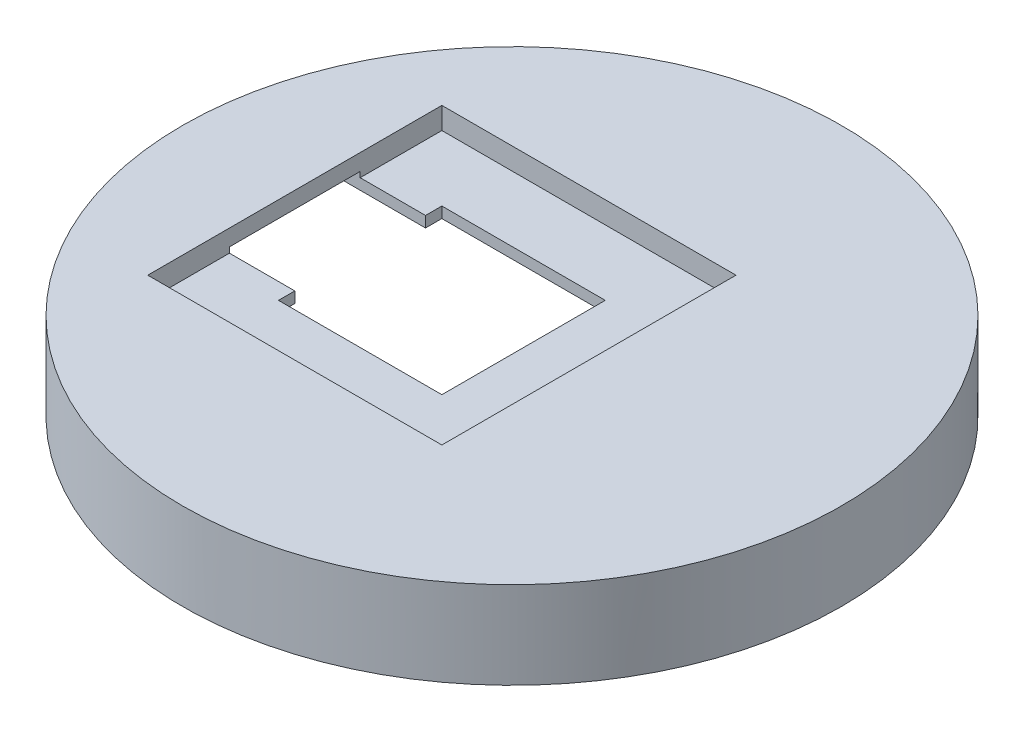
ISO-10303-21;
HEADER;
FILE_DESCRIPTION(('STEP AP214'),'2;1');
FILE_NAME('part.step','',(''),(''),'','','');
FILE_SCHEMA(('AUTOMOTIVE_DESIGN { 1 0 10303 214 1 1 1 1 }'));
ENDSEC;
DATA;
#1=APPLICATION_CONTEXT('core data for automotive mechanical design processes');
#2=APPLICATION_PROTOCOL_DEFINITION('international standard','automotive_design',2000,#1);
#3=PRODUCT_CONTEXT('',#1,'mechanical');
#4=PRODUCT('Part','Part','',(#3));
#5=PRODUCT_RELATED_PRODUCT_CATEGORY('part','',(#4));
#6=PRODUCT_DEFINITION_FORMATION('','',#4);
#7=PRODUCT_DEFINITION_CONTEXT('part definition',#1,'design');
#8=PRODUCT_DEFINITION('design','',#6,#7);
#9=PRODUCT_DEFINITION_SHAPE('','',#8);
#10=(LENGTH_UNIT() NAMED_UNIT(*) SI_UNIT(.MILLI.,.METRE.));
#11=(NAMED_UNIT(*) PLANE_ANGLE_UNIT() SI_UNIT($,.RADIAN.));
#12=(NAMED_UNIT(*) SI_UNIT($,.STERADIAN.) SOLID_ANGLE_UNIT());
#13=UNCERTAINTY_MEASURE_WITH_UNIT(LENGTH_MEASURE(1.E-05),#10,'distance_accuracy_value','');
#14=(GEOMETRIC_REPRESENTATION_CONTEXT(3) GLOBAL_UNCERTAINTY_ASSIGNED_CONTEXT((#13)) GLOBAL_UNIT_ASSIGNED_CONTEXT((#10,
#11,#12)) REPRESENTATION_CONTEXT('',''));
#15=CARTESIAN_POINT('',(0.,0.,0.));
#16=DIRECTION('',(0.,0.,1.));
#17=DIRECTION('',(1.,0.,0.));
#18=AXIS2_PLACEMENT_3D('',#15,#16,#17);
#19=CARTESIAN_POINT('',(1.06149692592431,8.000012,-7.49999999999999));
#20=DIRECTION('',(-1.,0.,0.));
#21=DIRECTION('',(0.,0.,1.));
#22=AXIS2_PLACEMENT_3D('',#19,#20,#21);
#23=PLANE('',#22);
#24=DIRECTION('',(0.,-1.,0.));
#25=VECTOR('',#24,1.);
#26=CARTESIAN_POINT('',(1.06149692592431,8.000012,7.5));
#27=LINE('',#26,#25);
#28=CARTESIAN_POINT('',(1.06149692592431,6.,7.5));
#29=VERTEX_POINT('',#28);
#30=CARTESIAN_POINT('',(1.06149692592431,5.,7.5));
#31=VERTEX_POINT('',#30);
#32=EDGE_CURVE('E231',#29,#31,#27,.T.);
#33=ORIENTED_EDGE('',*,*,#32,.F.);
#34=DIRECTION('',(0.,0.,-1.));
#35=VECTOR('',#34,1.);
#36=CARTESIAN_POINT('',(1.06149692592431,6.,-7.49999999999999));
#37=LINE('',#36,#35);
#38=CARTESIAN_POINT('',(1.06149692592431,6.,-7.49999999999999));
#39=VERTEX_POINT('',#38);
#40=EDGE_CURVE('E208',#29,#39,#37,.T.);
#41=ORIENTED_EDGE('',*,*,#40,.T.);
#42=DIRECTION('',(0.,-1.,0.));
#43=VECTOR('',#42,1.);
#44=CARTESIAN_POINT('',(1.06149692592431,8.000012,-7.49999999999999));
#45=LINE('',#44,#43);
#46=CARTESIAN_POINT('',(1.06149692592431,5.,-7.49999999999999));
#47=VERTEX_POINT('',#46);
#48=EDGE_CURVE('E240',#39,#47,#45,.T.);
#49=ORIENTED_EDGE('',*,*,#48,.T.);
#50=DIRECTION('',(0.,0.,1.));
#51=VECTOR('',#50,1.);
#52=CARTESIAN_POINT('',(1.06149692592431,5.,0.));
#53=LINE('',#52,#51);
#54=EDGE_CURVE('E260',#47,#31,#53,.T.);
#55=ORIENTED_EDGE('',*,*,#54,.T.);
#56=EDGE_LOOP('',(#33,#41,#49,#55));
#57=FACE_BOUND('',#56,.T.);
#58=ADVANCED_FACE('F43',(#57),#23,.T.);
#59=CARTESIAN_POINT('',(-13.9385030740757,8.000012,-7.49999999999999));
#60=DIRECTION('',(0.,0.,1.));
#61=DIRECTION('',(1.,0.,0.));
#62=AXIS2_PLACEMENT_3D('',#59,#60,#61);
#63=PLANE('',#62);
#64=ORIENTED_EDGE('',*,*,#48,.F.);
#65=DIRECTION('',(-1.,0.,0.));
#66=VECTOR('',#65,1.);
#67=CARTESIAN_POINT('',(-13.9385030740757,6.,-7.49999999999999));
#68=LINE('',#67,#66);
#69=CARTESIAN_POINT('',(-13.9385030740757,6.,-7.49999999999999));
#70=VERTEX_POINT('',#69);
#71=EDGE_CURVE('E216',#39,#70,#68,.T.);
#72=ORIENTED_EDGE('',*,*,#71,.T.);
#73=DIRECTION('',(0.,-1.,0.));
#74=VECTOR('',#73,1.);
#75=CARTESIAN_POINT('',(-13.9385030740757,8.000012,-7.49999999999999));
#76=LINE('',#75,#74);
#77=CARTESIAN_POINT('',(-13.9385030740757,5.,-7.49999999999999));
#78=VERTEX_POINT('',#77);
#79=EDGE_CURVE('E237',#70,#78,#76,.T.);
#80=ORIENTED_EDGE('',*,*,#79,.T.);
#81=DIRECTION('',(1.,0.,0.));
#82=VECTOR('',#81,1.);
#83=CARTESIAN_POINT('',(0.,5.,-7.49999999999999));
#84=LINE('',#83,#82);
#85=EDGE_CURVE('E256',#78,#47,#84,.T.);
#86=ORIENTED_EDGE('',*,*,#85,.T.);
#87=EDGE_LOOP('',(#64,#72,#80,#86));
#88=FACE_BOUND('',#87,.T.);
#89=ADVANCED_FACE('F374',(#88),#63,.T.);
#90=CARTESIAN_POINT('',(-13.9385030740757,8.000012,7.5));
#91=DIRECTION('',(0.,0.,-1.));
#92=DIRECTION('',(-1.,0.,0.));
#93=AXIS2_PLACEMENT_3D('',#90,#91,#92);
#94=PLANE('',#93);
#95=DIRECTION('',(0.,-1.,0.));
#96=VECTOR('',#95,1.);
#97=CARTESIAN_POINT('',(-13.9385030740757,8.000012,7.5));
#98=LINE('',#97,#96);
#99=CARTESIAN_POINT('',(-13.9385030740757,6.,7.5));
#100=VERTEX_POINT('',#99);
#101=CARTESIAN_POINT('',(-13.9385030740757,5.,7.5));
#102=VERTEX_POINT('',#101);
#103=EDGE_CURVE('E234',#100,#102,#98,.T.);
#104=ORIENTED_EDGE('',*,*,#103,.F.);
#105=DIRECTION('',(1.,0.,0.));
#106=VECTOR('',#105,1.);
#107=CARTESIAN_POINT('',(-13.9385030740757,6.,7.5));
#108=LINE('',#107,#106);
#109=EDGE_CURVE('E67',#100,#29,#108,.T.);
#110=ORIENTED_EDGE('',*,*,#109,.T.);
#111=ORIENTED_EDGE('',*,*,#32,.T.);
#112=DIRECTION('',(-1.,0.,0.));
#113=VECTOR('',#112,1.);
#114=CARTESIAN_POINT('',(0.,5.,7.5));
#115=LINE('',#114,#113);
#116=EDGE_CURVE('E252',#31,#102,#115,.T.);
#117=ORIENTED_EDGE('',*,*,#116,.T.);
#118=EDGE_LOOP('',(#104,#110,#111,#117));
#119=FACE_BOUND('',#118,.T.);
#120=ADVANCED_FACE('F369',(#119),#94,.T.);
#121=CARTESIAN_POINT('',(-13.9385030740757,8.000012,-7.49999999999999));
#122=DIRECTION('',(1.,0.,0.));
#123=DIRECTION('',(0.,0.,-1.));
#124=AXIS2_PLACEMENT_3D('',#121,#122,#123);
#125=PLANE('',#124);
#126=ORIENTED_EDGE('',*,*,#79,.F.);
#127=DIRECTION('',(0.,0.,1.));
#128=VECTOR('',#127,1.);
#129=CARTESIAN_POINT('',(-13.9385030740757,6.,-7.49999999999999));
#130=LINE('',#129,#128);
#131=CARTESIAN_POINT('',(-13.9385030740757,6.,-6.));
#132=VERTEX_POINT('',#131);
#133=EDGE_CURVE('E52',#70,#132,#130,.T.);
#134=ORIENTED_EDGE('',*,*,#133,.T.);
#135=DIRECTION('',(0.,1.,0.));
#136=VECTOR('',#135,1.);
#137=CARTESIAN_POINT('',(-13.9385030740757,6.5,-6.));
#138=LINE('',#137,#136);
#139=CARTESIAN_POINT('',(-13.9385030740757,5.,-6.));
#140=VERTEX_POINT('',#139);
#141=EDGE_CURVE('E247',#140,#132,#138,.T.);
#142=ORIENTED_EDGE('',*,*,#141,.F.);
#143=DIRECTION('',(0.,0.,-1.));
#144=VECTOR('',#143,1.);
#145=CARTESIAN_POINT('',(-13.9385030740757,5.,0.));
#146=LINE('',#145,#144);
#147=EDGE_CURVE('E248',#140,#78,#146,.T.);
#148=ORIENTED_EDGE('',*,*,#147,.T.);
#149=EDGE_LOOP('',(#126,#134,#142,#148));
#150=FACE_BOUND('',#149,.T.);
#151=ADVANCED_FACE('F331',(#150),#125,.T.);
#152=DIRECTION('',(0.,-1.,0.));
#153=VECTOR('',#152,1.);
#154=CARTESIAN_POINT('',(-13.9385030740757,6.5,6.));
#155=LINE('',#154,#153);
#156=CARTESIAN_POINT('',(-13.9385030740757,6.,6.));
#157=VERTEX_POINT('',#156);
#158=CARTESIAN_POINT('',(-13.9385030740757,5.,6.));
#159=VERTEX_POINT('',#158);
#160=EDGE_CURVE('E320',#157,#159,#155,.T.);
#161=ORIENTED_EDGE('',*,*,#160,.F.);
#162=EDGE_CURVE('E322',#157,#100,#130,.T.);
#163=ORIENTED_EDGE('',*,*,#162,.T.);
#164=ORIENTED_EDGE('',*,*,#103,.T.);
#165=EDGE_CURVE('E243',#102,#159,#146,.T.);
#166=ORIENTED_EDGE('',*,*,#165,.T.);
#167=EDGE_LOOP('',(#161,#163,#164,#166));
#168=FACE_BOUND('',#167,.T.);
#169=ADVANCED_FACE('F364',(#168),#125,.T.);
#170=CARTESIAN_POINT('',(0.,5.,0.));
#171=DIRECTION('',(0.,1.,0.));
#172=DIRECTION('',(0.,0.,1.));
#173=AXIS2_PLACEMENT_3D('',#170,#171,#172);
#174=PLANE('',#173);
#175=ORIENTED_EDGE('',*,*,#147,.F.);
#176=DIRECTION('',(1.,0.,0.));
#177=VECTOR('',#176,1.);
#178=CARTESIAN_POINT('',(0.,5.,-6.));
#179=LINE('',#178,#177);
#180=CARTESIAN_POINT('',(-28.1169432904788,5.,-6.));
#181=VERTEX_POINT('',#180);
#182=EDGE_CURVE('E312',#181,#140,#179,.T.);
#183=ORIENTED_EDGE('',*,*,#182,.F.);
#184=CARTESIAN_POINT('',(0.,5.,0.));
#185=DIRECTION('',(0.,1.,0.));
#186=DIRECTION('',(0.,0.,1.));
#187=AXIS2_PLACEMENT_3D('',#184,#185,#186);
#188=CIRCLE('',#187,28.75);
#189=CARTESIAN_POINT('',(-28.1169432904788,5.,6.));
#190=VERTEX_POINT('',#189);
#191=EDGE_CURVE('E294',#190,#181,#188,.T.);
#192=ORIENTED_EDGE('',*,*,#191,.F.);
#193=DIRECTION('',(-1.,0.,0.));
#194=VECTOR('',#193,1.);
#195=CARTESIAN_POINT('',(0.,5.,6.));
#196=LINE('',#195,#194);
#197=EDGE_CURVE('E306',#159,#190,#196,.T.);
#198=ORIENTED_EDGE('',*,*,#197,.F.);
#199=ORIENTED_EDGE('',*,*,#165,.F.);
#200=ORIENTED_EDGE('',*,*,#116,.F.);
#201=ORIENTED_EDGE('',*,*,#54,.F.);
#202=ORIENTED_EDGE('',*,*,#85,.F.);
#203=EDGE_LOOP('',(#175,#183,#192,#198,#199,#200,#201,#202));
#204=FACE_BOUND('',#203,.T.);
#205=ADVANCED_FACE('F340',(#204),#174,.F.);
#206=CARTESIAN_POINT('',(0.,8.,0.));
#207=DIRECTION('',(0.,1.,0.));
#208=DIRECTION('',(0.,0.,1.));
#209=AXIS2_PLACEMENT_3D('',#206,#207,#208);
#210=PLANE('',#209);
#211=DIRECTION('',(0.,0.,-1.));
#212=VECTOR('',#211,1.);
#213=CARTESIAN_POINT('',(7.06149692592431,8.,-13.5));
#214=LINE('',#213,#212);
#215=CARTESIAN_POINT('',(7.06149692592431,8.,13.5));
#216=VERTEX_POINT('',#215);
#217=CARTESIAN_POINT('',(7.06149692592431,8.,-13.5));
#218=VERTEX_POINT('',#217);
#219=EDGE_CURVE('E59',#216,#218,#214,.T.);
#220=ORIENTED_EDGE('',*,*,#219,.F.);
#221=DIRECTION('',(1.,0.,0.));
#222=VECTOR('',#221,1.);
#223=CARTESIAN_POINT('',(-19.9385030740757,8.,13.5));
#224=LINE('',#223,#222);
#225=CARTESIAN_POINT('',(-19.9385030740757,8.,13.5));
#226=VERTEX_POINT('',#225);
#227=EDGE_CURVE('E178',#226,#216,#224,.T.);
#228=ORIENTED_EDGE('',*,*,#227,.F.);
#229=DIRECTION('',(0.,0.,1.));
#230=VECTOR('',#229,1.);
#231=CARTESIAN_POINT('',(-19.9385030740757,8.,-13.5));
#232=LINE('',#231,#230);
#233=CARTESIAN_POINT('',(-19.9385030740757,8.,-13.5));
#234=VERTEX_POINT('',#233);
#235=EDGE_CURVE('E182',#234,#226,#232,.T.);
#236=ORIENTED_EDGE('',*,*,#235,.F.);
#237=DIRECTION('',(-1.,0.,0.));
#238=VECTOR('',#237,1.);
#239=CARTESIAN_POINT('',(-19.9385030740757,8.,-13.5));
#240=LINE('',#239,#238);
#241=EDGE_CURVE('E192',#218,#234,#240,.T.);
#242=ORIENTED_EDGE('',*,*,#241,.F.);
#243=EDGE_LOOP('',(#220,#228,#236,#242));
#244=FACE_BOUND('',#243,.T.);
#245=CARTESIAN_POINT('',(0.,8.,0.));
#246=DIRECTION('',(0.,1.,0.));
#247=DIRECTION('',(0.,0.,1.));
#248=AXIS2_PLACEMENT_3D('',#245,#246,#247);
#249=CIRCLE('',#248,30.25);
#250=CARTESIAN_POINT('',(0.,8.,30.25));
#251=VERTEX_POINT('',#250);
#252=EDGE_CURVE('E302',#251,#251,#249,.T.);
#253=ORIENTED_EDGE('',*,*,#252,.T.);
#254=EDGE_LOOP('',(#253));
#255=FACE_BOUND('',#254,.T.);
#256=ADVANCED_FACE('F382',(#244,#255),#210,.T.);
#257=CARTESIAN_POINT('',(0.,6.5,0.));
#258=DIRECTION('',(0.,1.,0.));
#259=DIRECTION('',(0.,0.,1.));
#260=AXIS2_PLACEMENT_3D('',#257,#258,#259);
#261=PLANE('',#260);
#262=DIRECTION('',(-1.,0.,0.));
#263=VECTOR('',#262,1.);
#264=CARTESIAN_POINT('',(-142.526664036245,6.5,-6.));
#265=LINE('',#264,#263);
#266=CARTESIAN_POINT('',(-19.9385030740757,6.5,-6.));
#267=VERTEX_POINT('',#266);
#268=CARTESIAN_POINT('',(-29.648988178351,6.5,-6.));
#269=VERTEX_POINT('',#268);
#270=EDGE_CURVE('E265',#267,#269,#265,.T.);
#271=ORIENTED_EDGE('',*,*,#270,.F.);
#272=DIRECTION('',(0.,0.,1.));
#273=VECTOR('',#272,1.);
#274=CARTESIAN_POINT('',(-19.9385030740757,6.5,0.));
#275=LINE('',#274,#273);
#276=CARTESIAN_POINT('',(-19.9385030740757,6.5,6.));
#277=VERTEX_POINT('',#276);
#278=EDGE_CURVE('E224',#267,#277,#275,.T.);
#279=ORIENTED_EDGE('',*,*,#278,.T.);
#280=DIRECTION('',(1.,0.,0.));
#281=VECTOR('',#280,1.);
#282=CARTESIAN_POINT('',(-142.526664036245,6.5,6.));
#283=LINE('',#282,#281);
#284=CARTESIAN_POINT('',(-29.648988178351,6.5,6.));
#285=VERTEX_POINT('',#284);
#286=EDGE_CURVE('E268',#285,#277,#283,.T.);
#287=ORIENTED_EDGE('',*,*,#286,.F.);
#288=CARTESIAN_POINT('',(0.,6.5,0.));
#289=DIRECTION('',(0.,1.,0.));
#290=DIRECTION('',(0.,0.,1.));
#291=AXIS2_PLACEMENT_3D('',#288,#289,#290);
#292=CIRCLE('',#291,30.25);
#293=EDGE_CURVE('E316',#269,#285,#292,.T.);
#294=ORIENTED_EDGE('',*,*,#293,.F.);
#295=EDGE_LOOP('',(#271,#279,#287,#294));
#296=FACE_BOUND('',#295,.T.);
#297=ADVANCED_FACE('F359',(#296),#261,.F.);
#298=CARTESIAN_POINT('',(-142.526664036245,6.5,-6.));
#299=DIRECTION('',(0.,0.,1.));
#300=DIRECTION('',(1.,0.,0.));
#301=AXIS2_PLACEMENT_3D('',#298,#299,#300);
#302=PLANE('',#301);
#303=DIRECTION('',(0.,-1.,0.));
#304=VECTOR('',#303,1.);
#305=CARTESIAN_POINT('',(-19.9385030740757,6.5,-6.));
#306=LINE('',#305,#304);
#307=CARTESIAN_POINT('',(-19.9385030740757,6.,-6.));
#308=VERTEX_POINT('',#307);
#309=EDGE_CURVE('E228',#267,#308,#306,.T.);
#310=ORIENTED_EDGE('',*,*,#309,.F.);
#311=ORIENTED_EDGE('',*,*,#270,.T.);
#312=DIRECTION('',(0.,-1.,0.));
#313=VECTOR('',#312,1.);
#314=CARTESIAN_POINT('',(-29.648988178351,8.,-6.));
#315=LINE('',#314,#313);
#316=CARTESIAN_POINT('',(-29.648988178351,0.,-6.));
#317=VERTEX_POINT('',#316);
#318=EDGE_CURVE('E290',#269,#317,#315,.T.);
#319=ORIENTED_EDGE('',*,*,#318,.T.);
#320=DIRECTION('',(-1.,0.,0.));
#321=VECTOR('',#320,1.);
#322=CARTESIAN_POINT('',(-142.526664036245,0.,-6.));
#323=LINE('',#322,#321);
#324=CARTESIAN_POINT('',(-28.1169432904788,0.,-6.));
#325=VERTEX_POINT('',#324);
#326=EDGE_CURVE('E264',#325,#317,#323,.T.);
#327=ORIENTED_EDGE('',*,*,#326,.F.);
#328=DIRECTION('',(0.,-1.,0.));
#329=VECTOR('',#328,1.);
#330=CARTESIAN_POINT('',(-28.1169432904788,5.,-6.));
#331=LINE('',#330,#329);
#332=EDGE_CURVE('E286',#181,#325,#331,.T.);
#333=ORIENTED_EDGE('',*,*,#332,.F.);
#334=ORIENTED_EDGE('',*,*,#182,.T.);
#335=ORIENTED_EDGE('',*,*,#141,.T.);
#336=DIRECTION('',(-1.,0.,0.));
#337=VECTOR('',#336,1.);
#338=CARTESIAN_POINT('',(-142.526664036245,6.,-6.));
#339=LINE('',#338,#337);
#340=EDGE_CURVE('E220',#132,#308,#339,.T.);
#341=ORIENTED_EDGE('',*,*,#340,.T.);
#342=EDGE_LOOP('',(#310,#311,#319,#327,#333,#334,#335,#341));
#343=FACE_BOUND('',#342,.T.);
#344=ADVANCED_FACE('F336',(#343),#302,.T.);
#345=CARTESIAN_POINT('',(-142.526664036245,6.5,6.));
#346=DIRECTION('',(0.,0.,-1.));
#347=DIRECTION('',(-1.,0.,0.));
#348=AXIS2_PLACEMENT_3D('',#345,#346,#347);
#349=PLANE('',#348);
#350=DIRECTION('',(0.,1.,0.));
#351=VECTOR('',#350,1.);
#352=CARTESIAN_POINT('',(-19.9385030740757,6.5,6.));
#353=LINE('',#352,#351);
#354=CARTESIAN_POINT('',(-19.9385030740757,6.,6.));
#355=VERTEX_POINT('',#354);
#356=EDGE_CURVE('E11',#355,#277,#353,.T.);
#357=ORIENTED_EDGE('',*,*,#356,.F.);
#358=DIRECTION('',(1.,0.,0.));
#359=VECTOR('',#358,1.);
#360=CARTESIAN_POINT('',(-142.526664036245,6.,6.));
#361=LINE('',#360,#359);
#362=EDGE_CURVE('E212',#355,#157,#361,.T.);
#363=ORIENTED_EDGE('',*,*,#362,.T.);
#364=ORIENTED_EDGE('',*,*,#160,.T.);
#365=ORIENTED_EDGE('',*,*,#197,.T.);
#366=DIRECTION('',(0.,-1.,0.));
#367=VECTOR('',#366,1.);
#368=CARTESIAN_POINT('',(-28.1169432904788,5.,6.));
#369=LINE('',#368,#367);
#370=CARTESIAN_POINT('',(-28.1169432904788,0.,6.));
#371=VERTEX_POINT('',#370);
#372=EDGE_CURVE('E273',#371,#190,#369,.F.);
#373=ORIENTED_EDGE('',*,*,#372,.F.);
#374=DIRECTION('',(1.,0.,0.));
#375=VECTOR('',#374,1.);
#376=CARTESIAN_POINT('',(-142.526664036245,0.,6.));
#377=LINE('',#376,#375);
#378=CARTESIAN_POINT('',(-29.648988178351,0.,6.));
#379=VERTEX_POINT('',#378);
#380=EDGE_CURVE('E269',#379,#371,#377,.T.);
#381=ORIENTED_EDGE('',*,*,#380,.F.);
#382=DIRECTION('',(0.,-1.,0.));
#383=VECTOR('',#382,1.);
#384=CARTESIAN_POINT('',(-29.648988178351,8.,6.));
#385=LINE('',#384,#383);
#386=EDGE_CURVE('E283',#379,#285,#385,.F.);
#387=ORIENTED_EDGE('',*,*,#386,.T.);
#388=ORIENTED_EDGE('',*,*,#286,.T.);
#389=EDGE_LOOP('',(#357,#363,#364,#365,#373,#381,#387,#388));
#390=FACE_BOUND('',#389,.T.);
#391=ADVANCED_FACE('F348',(#390),#349,.T.);
#392=CARTESIAN_POINT('',(0.,8.,0.));
#393=DIRECTION('',(0.,-1.,0.));
#394=DIRECTION('',(0.,0.,-1.));
#395=AXIS2_PLACEMENT_3D('',#392,#393,#394);
#396=CYLINDRICAL_SURFACE('',#395,30.25);
#397=ORIENTED_EDGE('',*,*,#252,.F.);
#398=EDGE_LOOP('',(#397));
#399=FACE_BOUND('',#398,.T.);
#400=ORIENTED_EDGE('',*,*,#318,.F.);
#401=ORIENTED_EDGE('',*,*,#293,.T.);
#402=ORIENTED_EDGE('',*,*,#386,.F.);
#403=CARTESIAN_POINT('',(0.,0.,0.));
#404=DIRECTION('',(0.,1.,0.));
#405=DIRECTION('',(0.,0.,1.));
#406=AXIS2_PLACEMENT_3D('',#403,#404,#405);
#407=CIRCLE('',#406,30.25);
#408=EDGE_CURVE('E298',#379,#317,#407,.T.);
#409=ORIENTED_EDGE('',*,*,#408,.T.);
#410=EDGE_LOOP('',(#400,#401,#402,#409));
#411=FACE_BOUND('',#410,.T.);
#412=ADVANCED_FACE('F45',(#399,#411),#396,.T.);
#413=CARTESIAN_POINT('',(0.,0.,0.));
#414=DIRECTION('',(0.,1.,0.));
#415=DIRECTION('',(0.,0.,1.));
#416=AXIS2_PLACEMENT_3D('',#413,#414,#415);
#417=PLANE('',#416);
#418=ORIENTED_EDGE('',*,*,#326,.T.);
#419=ORIENTED_EDGE('',*,*,#408,.F.);
#420=ORIENTED_EDGE('',*,*,#380,.T.);
#421=CARTESIAN_POINT('',(0.,0.,0.));
#422=DIRECTION('',(0.,1.,0.));
#423=DIRECTION('',(0.,0.,1.));
#424=AXIS2_PLACEMENT_3D('',#421,#422,#423);
#425=CIRCLE('',#424,28.75);
#426=EDGE_CURVE('E293',#371,#325,#425,.T.);
#427=ORIENTED_EDGE('',*,*,#426,.T.);
#428=EDGE_LOOP('',(#418,#419,#420,#427));
#429=FACE_BOUND('',#428,.T.);
#430=ADVANCED_FACE('F352',(#429),#417,.F.);
#431=CARTESIAN_POINT('',(0.,5.,0.));
#432=DIRECTION('',(0.,-1.,0.));
#433=DIRECTION('',(0.,0.,-1.));
#434=AXIS2_PLACEMENT_3D('',#431,#432,#433);
#435=CYLINDRICAL_SURFACE('',#434,28.75);
#436=ORIENTED_EDGE('',*,*,#191,.T.);
#437=ORIENTED_EDGE('',*,*,#332,.T.);
#438=ORIENTED_EDGE('',*,*,#426,.F.);
#439=ORIENTED_EDGE('',*,*,#372,.T.);
#440=EDGE_LOOP('',(#436,#437,#438,#439));
#441=FACE_BOUND('',#440,.T.);
#442=ADVANCED_FACE('F344',(#441),#435,.F.);
#443=CARTESIAN_POINT('',(7.06149692592431,6.,-13.5));
#444=DIRECTION('',(1.,0.,0.));
#445=DIRECTION('',(0.,0.,-1.));
#446=AXIS2_PLACEMENT_3D('',#443,#444,#445);
#447=PLANE('',#446);
#448=ORIENTED_EDGE('',*,*,#219,.T.);
#449=DIRECTION('',(0.,1.,0.));
#450=VECTOR('',#449,1.);
#451=CARTESIAN_POINT('',(7.06149692592431,6.,-13.5));
#452=LINE('',#451,#450);
#453=CARTESIAN_POINT('',(7.06149692592431,6.,-13.5));
#454=VERTEX_POINT('',#453);
#455=EDGE_CURVE('E154',#454,#218,#452,.T.);
#456=ORIENTED_EDGE('',*,*,#455,.F.);
#457=DIRECTION('',(0.,0.,-1.));
#458=VECTOR('',#457,1.);
#459=CARTESIAN_POINT('',(7.06149692592431,6.,-13.5));
#460=LINE('',#459,#458);
#461=CARTESIAN_POINT('',(7.06149692592431,6.,13.5));
#462=VERTEX_POINT('',#461);
#463=EDGE_CURVE('E158',#462,#454,#460,.T.);
#464=ORIENTED_EDGE('',*,*,#463,.F.);
#465=DIRECTION('',(0.,1.,0.));
#466=VECTOR('',#465,1.);
#467=CARTESIAN_POINT('',(7.06149692592431,6.,13.5));
#468=LINE('',#467,#466);
#469=EDGE_CURVE('E198',#462,#216,#468,.T.);
#470=ORIENTED_EDGE('',*,*,#469,.T.);
#471=EDGE_LOOP('',(#448,#456,#464,#470));
#472=FACE_BOUND('',#471,.T.);
#473=ADVANCED_FACE('F156',(#472),#447,.F.);
#474=CARTESIAN_POINT('',(-19.9385030740757,6.,13.5));
#475=DIRECTION('',(0.,0.,1.));
#476=DIRECTION('',(1.,0.,0.));
#477=AXIS2_PLACEMENT_3D('',#474,#475,#476);
#478=PLANE('',#477);
#479=ORIENTED_EDGE('',*,*,#227,.T.);
#480=ORIENTED_EDGE('',*,*,#469,.F.);
#481=DIRECTION('',(1.,0.,0.));
#482=VECTOR('',#481,1.);
#483=CARTESIAN_POINT('',(-19.9385030740757,6.,13.5));
#484=LINE('',#483,#482);
#485=CARTESIAN_POINT('',(-19.9385030740757,6.,13.5));
#486=VERTEX_POINT('',#485);
#487=EDGE_CURVE('E165',#486,#462,#484,.T.);
#488=ORIENTED_EDGE('',*,*,#487,.F.);
#489=DIRECTION('',(0.,1.,0.));
#490=VECTOR('',#489,1.);
#491=CARTESIAN_POINT('',(-19.9385030740757,6.,13.5));
#492=LINE('',#491,#490);
#493=EDGE_CURVE('E201',#486,#226,#492,.T.);
#494=ORIENTED_EDGE('',*,*,#493,.T.);
#495=EDGE_LOOP('',(#479,#480,#488,#494));
#496=FACE_BOUND('',#495,.T.);
#497=ADVANCED_FACE('F380',(#496),#478,.F.);
#498=CARTESIAN_POINT('',(-19.9385030740757,6.,-13.5));
#499=DIRECTION('',(-1.,0.,0.));
#500=DIRECTION('',(0.,0.,1.));
#501=AXIS2_PLACEMENT_3D('',#498,#499,#500);
#502=PLANE('',#501);
#503=ORIENTED_EDGE('',*,*,#309,.T.);
#504=DIRECTION('',(0.,0.,1.));
#505=VECTOR('',#504,1.);
#506=CARTESIAN_POINT('',(-19.9385030740757,6.,-13.5));
#507=LINE('',#506,#505);
#508=CARTESIAN_POINT('',(-19.9385030740757,6.,-13.5));
#509=VERTEX_POINT('',#508);
#510=EDGE_CURVE('E185',#509,#308,#507,.T.);
#511=ORIENTED_EDGE('',*,*,#510,.F.);
#512=DIRECTION('',(0.,1.,0.));
#513=VECTOR('',#512,1.);
#514=CARTESIAN_POINT('',(-19.9385030740757,6.,-13.5));
#515=LINE('',#514,#513);
#516=EDGE_CURVE('E164',#509,#234,#515,.T.);
#517=ORIENTED_EDGE('',*,*,#516,.T.);
#518=ORIENTED_EDGE('',*,*,#235,.T.);
#519=ORIENTED_EDGE('',*,*,#493,.F.);
#520=EDGE_CURVE('E173',#355,#486,#507,.T.);
#521=ORIENTED_EDGE('',*,*,#520,.F.);
#522=ORIENTED_EDGE('',*,*,#356,.T.);
#523=ORIENTED_EDGE('',*,*,#278,.F.);
#524=EDGE_LOOP('',(#503,#511,#517,#518,#519,#521,#522,#523));
#525=FACE_BOUND('',#524,.T.);
#526=ADVANCED_FACE('F361',(#525),#502,.F.);
#527=CARTESIAN_POINT('',(-19.9385030740757,6.,-13.5));
#528=DIRECTION('',(0.,0.,-1.));
#529=DIRECTION('',(-1.,0.,0.));
#530=AXIS2_PLACEMENT_3D('',#527,#528,#529);
#531=PLANE('',#530);
#532=ORIENTED_EDGE('',*,*,#241,.T.);
#533=ORIENTED_EDGE('',*,*,#516,.F.);
#534=DIRECTION('',(-1.,0.,0.));
#535=VECTOR('',#534,1.);
#536=CARTESIAN_POINT('',(-19.9385030740757,6.,-13.5));
#537=LINE('',#536,#535);
#538=EDGE_CURVE('E168',#454,#509,#537,.T.);
#539=ORIENTED_EDGE('',*,*,#538,.F.);
#540=ORIENTED_EDGE('',*,*,#455,.T.);
#541=EDGE_LOOP('',(#532,#533,#539,#540));
#542=FACE_BOUND('',#541,.T.);
#543=ADVANCED_FACE('F169',(#542),#531,.F.);
#544=CARTESIAN_POINT('',(0.,6.,0.));
#545=DIRECTION('',(0.,1.,0.));
#546=DIRECTION('',(0.,0.,1.));
#547=AXIS2_PLACEMENT_3D('',#544,#545,#546);
#548=PLANE('',#547);
#549=ORIENTED_EDGE('',*,*,#133,.F.);
#550=ORIENTED_EDGE('',*,*,#71,.F.);
#551=ORIENTED_EDGE('',*,*,#40,.F.);
#552=ORIENTED_EDGE('',*,*,#109,.F.);
#553=ORIENTED_EDGE('',*,*,#162,.F.);
#554=ORIENTED_EDGE('',*,*,#362,.F.);
#555=ORIENTED_EDGE('',*,*,#520,.T.);
#556=ORIENTED_EDGE('',*,*,#487,.T.);
#557=ORIENTED_EDGE('',*,*,#463,.T.);
#558=ORIENTED_EDGE('',*,*,#538,.T.);
#559=ORIENTED_EDGE('',*,*,#510,.T.);
#560=ORIENTED_EDGE('',*,*,#340,.F.);
#561=EDGE_LOOP('',(#549,#550,#551,#552,#553,#554,#555,#556,#557,#558,#559,#560));
#562=FACE_BOUND('',#561,.T.);
#563=ADVANCED_FACE('F175',(#562),#548,.T.);
#564=CLOSED_SHELL('',(#58,#89,#120,#151,#169,#205,#256,#297,#344,#391,#412,#430,#442,#473,#497,
#526,#543,#563));
#565=MANIFOLD_SOLID_BREP('B2',#564);
#566=ADVANCED_BREP_SHAPE_REPRESENTATION('',(#18,#565),#14);
#567=SHAPE_DEFINITION_REPRESENTATION(#9,#566);
ENDSEC;
END-ISO-10303-21;
